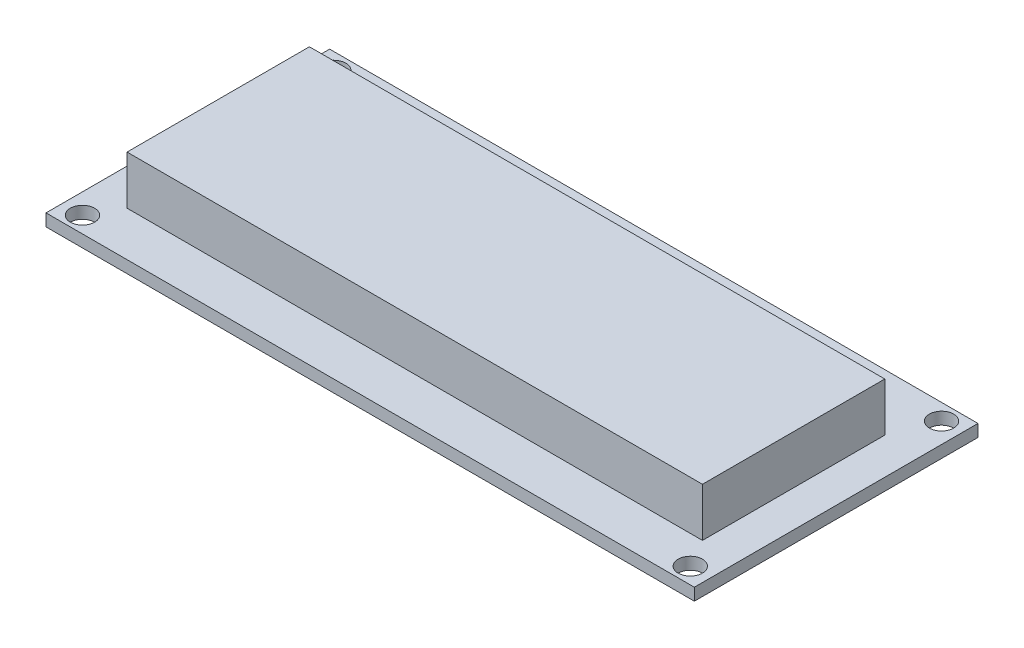
ISO-10303-21;
HEADER;
FILE_DESCRIPTION(('STEP AP214'),'2;1');
FILE_NAME('part.step','',(''),(''),'','','');
FILE_SCHEMA(('AUTOMOTIVE_DESIGN { 1 0 10303 214 1 1 1 1 }'));
ENDSEC;
DATA;
#1=APPLICATION_CONTEXT('core data for automotive mechanical design processes');
#2=APPLICATION_PROTOCOL_DEFINITION('international standard','automotive_design',2000,#1);
#3=PRODUCT_CONTEXT('',#1,'mechanical');
#4=PRODUCT('Part','Part','',(#3));
#5=PRODUCT_RELATED_PRODUCT_CATEGORY('part','',(#4));
#6=PRODUCT_DEFINITION_FORMATION('','',#4);
#7=PRODUCT_DEFINITION_CONTEXT('part definition',#1,'design');
#8=PRODUCT_DEFINITION('design','',#6,#7);
#9=PRODUCT_DEFINITION_SHAPE('','',#8);
#10=(LENGTH_UNIT() NAMED_UNIT(*) SI_UNIT(.MILLI.,.METRE.));
#11=(NAMED_UNIT(*) PLANE_ANGLE_UNIT() SI_UNIT($,.RADIAN.));
#12=(NAMED_UNIT(*) SI_UNIT($,.STERADIAN.) SOLID_ANGLE_UNIT());
#13=UNCERTAINTY_MEASURE_WITH_UNIT(LENGTH_MEASURE(1.E-05),#10,'distance_accuracy_value','');
#14=(GEOMETRIC_REPRESENTATION_CONTEXT(3) GLOBAL_UNCERTAINTY_ASSIGNED_CONTEXT((#13)) GLOBAL_UNIT_ASSIGNED_CONTEXT((#10,
#11,#12)) REPRESENTATION_CONTEXT('',''));
#15=CARTESIAN_POINT('',(0.,0.,0.));
#16=DIRECTION('',(0.,0.,1.));
#17=DIRECTION('',(1.,0.,0.));
#18=AXIS2_PLACEMENT_3D('',#15,#16,#17);
#19=CARTESIAN_POINT('',(0.,0.,0.));
#20=DIRECTION('',(0.,1.,0.));
#21=DIRECTION('',(0.,0.,1.));
#22=AXIS2_PLACEMENT_3D('',#19,#20,#21);
#23=PLANE('',#22);
#24=CARTESIAN_POINT('',(2.5,0.,33.));
#25=DIRECTION('',(0.,1.,0.));
#26=DIRECTION('',(0.,0.,-1.));
#27=AXIS2_PLACEMENT_3D('',#24,#25,#26);
#28=CIRCLE('',#27,1.5);
#29=CARTESIAN_POINT('',(2.5,0.,31.5));
#30=VERTEX_POINT('',#29);
#31=EDGE_CURVE('E242',#30,#30,#28,.T.);
#32=ORIENTED_EDGE('',*,*,#31,.T.);
#33=EDGE_LOOP('',(#32));
#34=FACE_BOUND('',#33,.T.);
#35=CARTESIAN_POINT('',(77.5,0.,33.));
#36=DIRECTION('',(0.,1.,0.));
#37=DIRECTION('',(0.,0.,1.));
#38=AXIS2_PLACEMENT_3D('',#35,#36,#37);
#39=CIRCLE('',#38,1.5);
#40=CARTESIAN_POINT('',(77.5,0.,34.5));
#41=VERTEX_POINT('',#40);
#42=EDGE_CURVE('E246',#41,#41,#39,.T.);
#43=ORIENTED_EDGE('',*,*,#42,.T.);
#44=EDGE_LOOP('',(#43));
#45=FACE_BOUND('',#44,.T.);
#46=CARTESIAN_POINT('',(77.5,0.,2.));
#47=DIRECTION('',(0.,1.,0.));
#48=DIRECTION('',(0.,0.,-1.));
#49=AXIS2_PLACEMENT_3D('',#46,#47,#48);
#50=CIRCLE('',#49,1.5);
#51=CARTESIAN_POINT('',(77.5,0.,0.500000000000002));
#52=VERTEX_POINT('',#51);
#53=EDGE_CURVE('E252',#52,#52,#50,.T.);
#54=ORIENTED_EDGE('',*,*,#53,.T.);
#55=EDGE_LOOP('',(#54));
#56=FACE_BOUND('',#55,.T.);
#57=CARTESIAN_POINT('',(2.5,0.,2.));
#58=DIRECTION('',(0.,1.,0.));
#59=DIRECTION('',(0.,0.,1.));
#60=AXIS2_PLACEMENT_3D('',#57,#58,#59);
#61=CIRCLE('',#60,1.5);
#62=CARTESIAN_POINT('',(2.5,0.,3.5));
#63=VERTEX_POINT('',#62);
#64=EDGE_CURVE('E258',#63,#63,#61,.T.);
#65=ORIENTED_EDGE('',*,*,#64,.T.);
#66=EDGE_LOOP('',(#65));
#67=FACE_BOUND('',#66,.T.);
#68=DIRECTION('',(-1.,0.,0.));
#69=VECTOR('',#68,1.);
#70=CARTESIAN_POINT('',(0.,0.,0.));
#71=LINE('',#70,#69);
#72=CARTESIAN_POINT('',(5.5,0.,0.));
#73=VERTEX_POINT('',#72);
#74=CARTESIAN_POINT('',(0.,0.,0.));
#75=VERTEX_POINT('',#74);
#76=EDGE_CURVE('E284',#73,#75,#71,.T.);
#77=ORIENTED_EDGE('',*,*,#76,.F.);
#78=DIRECTION('',(0.,0.,1.));
#79=VECTOR('',#78,1.);
#80=CARTESIAN_POINT('',(5.5,0.,0.));
#81=LINE('',#80,#79);
#82=CARTESIAN_POINT('',(5.5,0.,3.5));
#83=VERTEX_POINT('',#82);
#84=EDGE_CURVE('E64',#73,#83,#81,.T.);
#85=ORIENTED_EDGE('',*,*,#84,.T.);
#86=DIRECTION('',(1.,0.,0.));
#87=VECTOR('',#86,1.);
#88=CARTESIAN_POINT('',(0.,0.,3.5));
#89=LINE('',#88,#87);
#90=CARTESIAN_POINT('',(50.,0.,3.5));
#91=VERTEX_POINT('',#90);
#92=EDGE_CURVE('E298',#83,#91,#89,.T.);
#93=ORIENTED_EDGE('',*,*,#92,.T.);
#94=DIRECTION('',(0.,0.,1.));
#95=VECTOR('',#94,1.);
#96=CARTESIAN_POINT('',(50.,0.,0.));
#97=LINE('',#96,#95);
#98=CARTESIAN_POINT('',(50.,0.,0.));
#99=VERTEX_POINT('',#98);
#100=EDGE_CURVE('E199',#99,#91,#97,.T.);
#101=ORIENTED_EDGE('',*,*,#100,.F.);
#102=CARTESIAN_POINT('',(80.,0.,0.));
#103=VERTEX_POINT('',#102);
#104=EDGE_CURVE('E271',#103,#99,#71,.T.);
#105=ORIENTED_EDGE('',*,*,#104,.F.);
#106=DIRECTION('',(0.,0.,-1.));
#107=VECTOR('',#106,1.);
#108=CARTESIAN_POINT('',(80.,0.,0.));
#109=LINE('',#108,#107);
#110=CARTESIAN_POINT('',(80.,0.,35.));
#111=VERTEX_POINT('',#110);
#112=EDGE_CURVE('E282',#111,#103,#109,.T.);
#113=ORIENTED_EDGE('',*,*,#112,.F.);
#114=DIRECTION('',(1.,0.,0.));
#115=VECTOR('',#114,1.);
#116=CARTESIAN_POINT('',(0.,0.,35.));
#117=LINE('',#116,#115);
#118=CARTESIAN_POINT('',(0.,0.,35.));
#119=VERTEX_POINT('',#118);
#120=EDGE_CURVE('E280',#119,#111,#117,.T.);
#121=ORIENTED_EDGE('',*,*,#120,.F.);
#122=DIRECTION('',(0.,0.,1.));
#123=VECTOR('',#122,1.);
#124=CARTESIAN_POINT('',(0.,0.,0.));
#125=LINE('',#124,#123);
#126=EDGE_CURVE('E264',#75,#119,#125,.T.);
#127=ORIENTED_EDGE('',*,*,#126,.F.);
#128=EDGE_LOOP('',(#77,#85,#93,#101,#105,#113,#121,#127));
#129=FACE_BOUND('',#128,.T.);
#130=DIRECTION('',(0.,0.,1.));
#131=VECTOR('',#130,1.);
#132=CARTESIAN_POINT('',(4.5,0.,0.));
#133=LINE('',#132,#131);
#134=CARTESIAN_POINT('',(4.5,0.,7.));
#135=VERTEX_POINT('',#134);
#136=CARTESIAN_POINT('',(4.5,0.,29.5));
#137=VERTEX_POINT('',#136);
#138=EDGE_CURVE('E49',#135,#137,#133,.T.);
#139=ORIENTED_EDGE('',*,*,#138,.T.);
#140=DIRECTION('',(1.,0.,0.));
#141=VECTOR('',#140,1.);
#142=CARTESIAN_POINT('',(0.,0.,29.5));
#143=LINE('',#142,#141);
#144=CARTESIAN_POINT('',(75.5,0.,29.5));
#145=VERTEX_POINT('',#144);
#146=EDGE_CURVE('E11',#137,#145,#143,.T.);
#147=ORIENTED_EDGE('',*,*,#146,.T.);
#148=DIRECTION('',(0.,0.,-1.));
#149=VECTOR('',#148,1.);
#150=CARTESIAN_POINT('',(75.5,0.,0.));
#151=LINE('',#150,#149);
#152=CARTESIAN_POINT('',(75.5,0.,7.));
#153=VERTEX_POINT('',#152);
#154=EDGE_CURVE('E56',#145,#153,#151,.T.);
#155=ORIENTED_EDGE('',*,*,#154,.T.);
#156=DIRECTION('',(-1.,0.,0.));
#157=VECTOR('',#156,1.);
#158=CARTESIAN_POINT('',(0.,0.,7.));
#159=LINE('',#158,#157);
#160=EDGE_CURVE('E301',#153,#135,#159,.T.);
#161=ORIENTED_EDGE('',*,*,#160,.T.);
#162=EDGE_LOOP('',(#139,#147,#155,#161));
#163=FACE_BOUND('',#162,.T.);
#164=ADVANCED_FACE('F41',(#34,#45,#56,#67,#129,#163),#23,.F.);
#165=CARTESIAN_POINT('',(0.,1.5,0.));
#166=DIRECTION('',(0.,1.,0.));
#167=DIRECTION('',(0.,0.,1.));
#168=AXIS2_PLACEMENT_3D('',#165,#166,#167);
#169=PLANE('',#168);
#170=DIRECTION('',(-1.,0.,0.));
#171=VECTOR('',#170,1.);
#172=CARTESIAN_POINT('',(0.,1.5,0.));
#173=LINE('',#172,#171);
#174=CARTESIAN_POINT('',(80.,1.5,0.));
#175=VERTEX_POINT('',#174);
#176=CARTESIAN_POINT('',(0.,1.5,0.));
#177=VERTEX_POINT('',#176);
#178=EDGE_CURVE('E275',#175,#177,#173,.T.);
#179=ORIENTED_EDGE('',*,*,#178,.T.);
#180=DIRECTION('',(0.,0.,1.));
#181=VECTOR('',#180,1.);
#182=CARTESIAN_POINT('',(0.,1.5,0.));
#183=LINE('',#182,#181);
#184=CARTESIAN_POINT('',(0.,1.5,35.));
#185=VERTEX_POINT('',#184);
#186=EDGE_CURVE('E267',#177,#185,#183,.T.);
#187=ORIENTED_EDGE('',*,*,#186,.T.);
#188=DIRECTION('',(1.,0.,0.));
#189=VECTOR('',#188,1.);
#190=CARTESIAN_POINT('',(0.,1.5,35.));
#191=LINE('',#190,#189);
#192=CARTESIAN_POINT('',(80.,1.5,35.));
#193=VERTEX_POINT('',#192);
#194=EDGE_CURVE('E270',#185,#193,#191,.T.);
#195=ORIENTED_EDGE('',*,*,#194,.T.);
#196=DIRECTION('',(0.,0.,-1.));
#197=VECTOR('',#196,1.);
#198=CARTESIAN_POINT('',(80.,1.5,0.));
#199=LINE('',#198,#197);
#200=EDGE_CURVE('E273',#193,#175,#199,.T.);
#201=ORIENTED_EDGE('',*,*,#200,.T.);
#202=EDGE_LOOP('',(#179,#187,#195,#201));
#203=FACE_BOUND('',#202,.T.);
#204=DIRECTION('',(0.,0.,1.));
#205=VECTOR('',#204,1.);
#206=CARTESIAN_POINT('',(4.5,1.5,7.));
#207=LINE('',#206,#205);
#208=CARTESIAN_POINT('',(4.5,1.5,7.));
#209=VERTEX_POINT('',#208);
#210=CARTESIAN_POINT('',(4.5,1.5,29.5));
#211=VERTEX_POINT('',#210);
#212=EDGE_CURVE('E211',#209,#211,#207,.T.);
#213=ORIENTED_EDGE('',*,*,#212,.F.);
#214=DIRECTION('',(-1.,0.,0.));
#215=VECTOR('',#214,1.);
#216=CARTESIAN_POINT('',(4.5,1.5,7.));
#217=LINE('',#216,#215);
#218=CARTESIAN_POINT('',(75.5,1.5,7.));
#219=VERTEX_POINT('',#218);
#220=EDGE_CURVE('E216',#219,#209,#217,.T.);
#221=ORIENTED_EDGE('',*,*,#220,.F.);
#222=DIRECTION('',(0.,0.,-1.));
#223=VECTOR('',#222,1.);
#224=CARTESIAN_POINT('',(75.5,1.5,7.));
#225=LINE('',#224,#223);
#226=CARTESIAN_POINT('',(75.5,1.5,29.5));
#227=VERTEX_POINT('',#226);
#228=EDGE_CURVE('E227',#227,#219,#225,.T.);
#229=ORIENTED_EDGE('',*,*,#228,.F.);
#230=DIRECTION('',(1.,0.,0.));
#231=VECTOR('',#230,1.);
#232=CARTESIAN_POINT('',(4.5,1.5,29.5));
#233=LINE('',#232,#231);
#234=EDGE_CURVE('E224',#211,#227,#233,.T.);
#235=ORIENTED_EDGE('',*,*,#234,.F.);
#236=EDGE_LOOP('',(#213,#221,#229,#235));
#237=FACE_BOUND('',#236,.T.);
#238=CARTESIAN_POINT('',(77.5,1.5,33.));
#239=DIRECTION('',(0.,1.,0.));
#240=DIRECTION('',(0.,0.,1.));
#241=AXIS2_PLACEMENT_3D('',#238,#239,#240);
#242=CIRCLE('',#241,1.5);
#243=CARTESIAN_POINT('',(77.5,1.5,34.5));
#244=VERTEX_POINT('',#243);
#245=EDGE_CURVE('E249',#244,#244,#242,.T.);
#246=ORIENTED_EDGE('',*,*,#245,.F.);
#247=EDGE_LOOP('',(#246));
#248=FACE_BOUND('',#247,.T.);
#249=CARTESIAN_POINT('',(2.5,1.5,2.));
#250=DIRECTION('',(0.,1.,0.));
#251=DIRECTION('',(0.,0.,1.));
#252=AXIS2_PLACEMENT_3D('',#249,#250,#251);
#253=CIRCLE('',#252,1.5);
#254=CARTESIAN_POINT('',(2.5,1.5,3.5));
#255=VERTEX_POINT('',#254);
#256=EDGE_CURVE('E261',#255,#255,#253,.T.);
#257=ORIENTED_EDGE('',*,*,#256,.F.);
#258=EDGE_LOOP('',(#257));
#259=FACE_BOUND('',#258,.T.);
#260=CARTESIAN_POINT('',(77.5,1.5,2.));
#261=DIRECTION('',(0.,1.,0.));
#262=DIRECTION('',(0.,0.,-1.));
#263=AXIS2_PLACEMENT_3D('',#260,#261,#262);
#264=CIRCLE('',#263,1.5);
#265=CARTESIAN_POINT('',(77.5,1.5,0.500000000000002));
#266=VERTEX_POINT('',#265);
#267=EDGE_CURVE('E255',#266,#266,#264,.T.);
#268=ORIENTED_EDGE('',*,*,#267,.F.);
#269=EDGE_LOOP('',(#268));
#270=FACE_BOUND('',#269,.T.);
#271=CARTESIAN_POINT('',(2.5,1.5,33.));
#272=DIRECTION('',(0.,1.,0.));
#273=DIRECTION('',(0.,0.,-1.));
#274=AXIS2_PLACEMENT_3D('',#271,#272,#273);
#275=CIRCLE('',#274,1.5);
#276=CARTESIAN_POINT('',(2.5,1.5,31.5));
#277=VERTEX_POINT('',#276);
#278=EDGE_CURVE('E243',#277,#277,#275,.T.);
#279=ORIENTED_EDGE('',*,*,#278,.F.);
#280=EDGE_LOOP('',(#279));
#281=FACE_BOUND('',#280,.T.);
#282=ADVANCED_FACE('F321',(#203,#237,#248,#259,#270,#281),#169,.T.);
#283=CARTESIAN_POINT('',(0.,1.5,0.));
#284=DIRECTION('',(1.,0.,0.));
#285=DIRECTION('',(0.,0.,-1.));
#286=AXIS2_PLACEMENT_3D('',#283,#284,#285);
#287=PLANE('',#286);
#288=ORIENTED_EDGE('',*,*,#126,.T.);
#289=DIRECTION('',(0.,-1.,0.));
#290=VECTOR('',#289,1.);
#291=CARTESIAN_POINT('',(0.,1.5,35.));
#292=LINE('',#291,#290);
#293=EDGE_CURVE('E295',#185,#119,#292,.T.);
#294=ORIENTED_EDGE('',*,*,#293,.F.);
#295=ORIENTED_EDGE('',*,*,#186,.F.);
#296=DIRECTION('',(0.,-1.,0.));
#297=VECTOR('',#296,1.);
#298=CARTESIAN_POINT('',(0.,1.5,0.));
#299=LINE('',#298,#297);
#300=EDGE_CURVE('E277',#177,#75,#299,.T.);
#301=ORIENTED_EDGE('',*,*,#300,.T.);
#302=EDGE_LOOP('',(#288,#294,#295,#301));
#303=FACE_BOUND('',#302,.T.);
#304=ADVANCED_FACE('F43',(#303),#287,.F.);
#305=CARTESIAN_POINT('',(0.,1.5,35.));
#306=DIRECTION('',(0.,0.,-1.));
#307=DIRECTION('',(-1.,0.,0.));
#308=AXIS2_PLACEMENT_3D('',#305,#306,#307);
#309=PLANE('',#308);
#310=ORIENTED_EDGE('',*,*,#120,.T.);
#311=DIRECTION('',(0.,-1.,0.));
#312=VECTOR('',#311,1.);
#313=CARTESIAN_POINT('',(80.,1.5,35.));
#314=LINE('',#313,#312);
#315=EDGE_CURVE('E292',#193,#111,#314,.T.);
#316=ORIENTED_EDGE('',*,*,#315,.F.);
#317=ORIENTED_EDGE('',*,*,#194,.F.);
#318=ORIENTED_EDGE('',*,*,#293,.T.);
#319=EDGE_LOOP('',(#310,#316,#317,#318));
#320=FACE_BOUND('',#319,.T.);
#321=ADVANCED_FACE('F339',(#320),#309,.F.);
#322=CARTESIAN_POINT('',(80.,1.5,0.));
#323=DIRECTION('',(-1.,0.,0.));
#324=DIRECTION('',(0.,0.,1.));
#325=AXIS2_PLACEMENT_3D('',#322,#323,#324);
#326=PLANE('',#325);
#327=ORIENTED_EDGE('',*,*,#112,.T.);
#328=DIRECTION('',(0.,-1.,0.));
#329=VECTOR('',#328,1.);
#330=CARTESIAN_POINT('',(80.,1.5,0.));
#331=LINE('',#330,#329);
#332=EDGE_CURVE('E289',#175,#103,#331,.T.);
#333=ORIENTED_EDGE('',*,*,#332,.F.);
#334=ORIENTED_EDGE('',*,*,#200,.F.);
#335=ORIENTED_EDGE('',*,*,#315,.T.);
#336=EDGE_LOOP('',(#327,#333,#334,#335));
#337=FACE_BOUND('',#336,.T.);
#338=ADVANCED_FACE('F336',(#337),#326,.F.);
#339=CARTESIAN_POINT('',(0.,1.5,0.));
#340=DIRECTION('',(0.,0.,1.));
#341=DIRECTION('',(1.,0.,0.));
#342=AXIS2_PLACEMENT_3D('',#339,#340,#341);
#343=PLANE('',#342);
#344=ORIENTED_EDGE('',*,*,#300,.F.);
#345=ORIENTED_EDGE('',*,*,#178,.F.);
#346=ORIENTED_EDGE('',*,*,#332,.T.);
#347=ORIENTED_EDGE('',*,*,#104,.T.);
#348=DIRECTION('',(0.,1.,0.));
#349=VECTOR('',#348,1.);
#350=CARTESIAN_POINT('',(50.,-10.,0.));
#351=LINE('',#350,#349);
#352=CARTESIAN_POINT('',(50.,-10.,0.));
#353=VERTEX_POINT('',#352);
#354=EDGE_CURVE('E203',#353,#99,#351,.T.);
#355=ORIENTED_EDGE('',*,*,#354,.F.);
#356=DIRECTION('',(1.,0.,0.));
#357=VECTOR('',#356,1.);
#358=CARTESIAN_POINT('',(5.5,-10.,0.));
#359=LINE('',#358,#357);
#360=CARTESIAN_POINT('',(5.5,-10.,0.));
#361=VERTEX_POINT('',#360);
#362=EDGE_CURVE('E190',#361,#353,#359,.T.);
#363=ORIENTED_EDGE('',*,*,#362,.F.);
#364=DIRECTION('',(0.,1.,0.));
#365=VECTOR('',#364,1.);
#366=CARTESIAN_POINT('',(5.5,-10.,0.));
#367=LINE('',#366,#365);
#368=EDGE_CURVE('E200',#361,#73,#367,.T.);
#369=ORIENTED_EDGE('',*,*,#368,.T.);
#370=ORIENTED_EDGE('',*,*,#76,.T.);
#371=EDGE_LOOP('',(#344,#345,#346,#347,#355,#363,#369,#370));
#372=FACE_BOUND('',#371,.T.);
#373=ADVANCED_FACE('F332',(#372),#343,.F.);
#374=CARTESIAN_POINT('',(2.5,1.5,2.));
#375=DIRECTION('',(0.,-1.,0.));
#376=DIRECTION('',(0.,0.,-1.));
#377=AXIS2_PLACEMENT_3D('',#374,#375,#376);
#378=CYLINDRICAL_SURFACE('',#377,1.5);
#379=ORIENTED_EDGE('',*,*,#256,.T.);
#380=EDGE_LOOP('',(#379));
#381=FACE_BOUND('',#380,.T.);
#382=ORIENTED_EDGE('',*,*,#64,.F.);
#383=EDGE_LOOP('',(#382));
#384=FACE_BOUND('',#383,.T.);
#385=ADVANCED_FACE('F335',(#381,#384),#378,.F.);
#386=CARTESIAN_POINT('',(77.5,1.5,2.));
#387=DIRECTION('',(0.,-1.,0.));
#388=DIRECTION('',(0.,0.,-1.));
#389=AXIS2_PLACEMENT_3D('',#386,#387,#388);
#390=CYLINDRICAL_SURFACE('',#389,1.5);
#391=ORIENTED_EDGE('',*,*,#267,.T.);
#392=EDGE_LOOP('',(#391));
#393=FACE_BOUND('',#392,.T.);
#394=ORIENTED_EDGE('',*,*,#53,.F.);
#395=EDGE_LOOP('',(#394));
#396=FACE_BOUND('',#395,.T.);
#397=ADVANCED_FACE('F403',(#393,#396),#390,.F.);
#398=CARTESIAN_POINT('',(77.5,1.5,33.));
#399=DIRECTION('',(0.,-1.,0.));
#400=DIRECTION('',(0.,0.,-1.));
#401=AXIS2_PLACEMENT_3D('',#398,#399,#400);
#402=CYLINDRICAL_SURFACE('',#401,1.5);
#403=ORIENTED_EDGE('',*,*,#245,.T.);
#404=EDGE_LOOP('',(#403));
#405=FACE_BOUND('',#404,.T.);
#406=ORIENTED_EDGE('',*,*,#42,.F.);
#407=EDGE_LOOP('',(#406));
#408=FACE_BOUND('',#407,.T.);
#409=ADVANCED_FACE('F399',(#405,#408),#402,.F.);
#410=CARTESIAN_POINT('',(2.5,1.5,33.));
#411=DIRECTION('',(0.,-1.,0.));
#412=DIRECTION('',(0.,0.,-1.));
#413=AXIS2_PLACEMENT_3D('',#410,#411,#412);
#414=CYLINDRICAL_SURFACE('',#413,1.5);
#415=ORIENTED_EDGE('',*,*,#278,.T.);
#416=EDGE_LOOP('',(#415));
#417=FACE_BOUND('',#416,.T.);
#418=ORIENTED_EDGE('',*,*,#31,.F.);
#419=EDGE_LOOP('',(#418));
#420=FACE_BOUND('',#419,.T.);
#421=ADVANCED_FACE('F395',(#417,#420),#414,.F.);
#422=CARTESIAN_POINT('',(4.5,7.5,7.));
#423=DIRECTION('',(1.,0.,0.));
#424=DIRECTION('',(0.,0.,-1.));
#425=AXIS2_PLACEMENT_3D('',#422,#423,#424);
#426=PLANE('',#425);
#427=ORIENTED_EDGE('',*,*,#212,.T.);
#428=DIRECTION('',(0.,-1.,0.));
#429=VECTOR('',#428,1.);
#430=CARTESIAN_POINT('',(4.5,7.5,29.5));
#431=LINE('',#430,#429);
#432=CARTESIAN_POINT('',(4.5,7.5,29.5));
#433=VERTEX_POINT('',#432);
#434=EDGE_CURVE('E239',#433,#211,#431,.T.);
#435=ORIENTED_EDGE('',*,*,#434,.F.);
#436=DIRECTION('',(0.,0.,1.));
#437=VECTOR('',#436,1.);
#438=CARTESIAN_POINT('',(4.5,7.5,7.));
#439=LINE('',#438,#437);
#440=CARTESIAN_POINT('',(4.5,7.5,7.));
#441=VERTEX_POINT('',#440);
#442=EDGE_CURVE('E212',#441,#433,#439,.T.);
#443=ORIENTED_EDGE('',*,*,#442,.F.);
#444=DIRECTION('',(0.,-1.,0.));
#445=VECTOR('',#444,1.);
#446=CARTESIAN_POINT('',(4.5,7.5,7.));
#447=LINE('',#446,#445);
#448=EDGE_CURVE('E222',#441,#209,#447,.T.);
#449=ORIENTED_EDGE('',*,*,#448,.T.);
#450=EDGE_LOOP('',(#427,#435,#443,#449));
#451=FACE_BOUND('',#450,.T.);
#452=ADVANCED_FACE('F391',(#451),#426,.F.);
#453=CARTESIAN_POINT('',(4.5,7.5,29.5));
#454=DIRECTION('',(0.,0.,-1.));
#455=DIRECTION('',(-1.,0.,0.));
#456=AXIS2_PLACEMENT_3D('',#453,#454,#455);
#457=PLANE('',#456);
#458=ORIENTED_EDGE('',*,*,#234,.T.);
#459=DIRECTION('',(0.,-1.,0.));
#460=VECTOR('',#459,1.);
#461=CARTESIAN_POINT('',(75.5,7.5,29.5));
#462=LINE('',#461,#460);
#463=CARTESIAN_POINT('',(75.5,7.5,29.5));
#464=VERTEX_POINT('',#463);
#465=EDGE_CURVE('E236',#464,#227,#462,.T.);
#466=ORIENTED_EDGE('',*,*,#465,.F.);
#467=DIRECTION('',(1.,0.,0.));
#468=VECTOR('',#467,1.);
#469=CARTESIAN_POINT('',(4.5,7.5,29.5));
#470=LINE('',#469,#468);
#471=EDGE_CURVE('E215',#433,#464,#470,.T.);
#472=ORIENTED_EDGE('',*,*,#471,.F.);
#473=ORIENTED_EDGE('',*,*,#434,.T.);
#474=EDGE_LOOP('',(#458,#466,#472,#473));
#475=FACE_BOUND('',#474,.T.);
#476=ADVANCED_FACE('F387',(#475),#457,.F.);
#477=CARTESIAN_POINT('',(75.5,7.5,7.));
#478=DIRECTION('',(-1.,0.,0.));
#479=DIRECTION('',(0.,0.,1.));
#480=AXIS2_PLACEMENT_3D('',#477,#478,#479);
#481=PLANE('',#480);
#482=ORIENTED_EDGE('',*,*,#228,.T.);
#483=DIRECTION('',(0.,-1.,0.));
#484=VECTOR('',#483,1.);
#485=CARTESIAN_POINT('',(75.5,7.5,7.));
#486=LINE('',#485,#484);
#487=CARTESIAN_POINT('',(75.5,7.5,7.));
#488=VERTEX_POINT('',#487);
#489=EDGE_CURVE('E233',#488,#219,#486,.T.);
#490=ORIENTED_EDGE('',*,*,#489,.F.);
#491=DIRECTION('',(0.,0.,-1.));
#492=VECTOR('',#491,1.);
#493=CARTESIAN_POINT('',(75.5,7.5,7.));
#494=LINE('',#493,#492);
#495=EDGE_CURVE('E218',#464,#488,#494,.T.);
#496=ORIENTED_EDGE('',*,*,#495,.F.);
#497=ORIENTED_EDGE('',*,*,#465,.T.);
#498=EDGE_LOOP('',(#482,#490,#496,#497));
#499=FACE_BOUND('',#498,.T.);
#500=ADVANCED_FACE('F384',(#499),#481,.F.);
#501=CARTESIAN_POINT('',(4.5,7.5,7.));
#502=DIRECTION('',(0.,0.,1.));
#503=DIRECTION('',(1.,0.,0.));
#504=AXIS2_PLACEMENT_3D('',#501,#502,#503);
#505=PLANE('',#504);
#506=ORIENTED_EDGE('',*,*,#220,.T.);
#507=ORIENTED_EDGE('',*,*,#448,.F.);
#508=DIRECTION('',(-1.,0.,0.));
#509=VECTOR('',#508,1.);
#510=CARTESIAN_POINT('',(4.5,7.5,7.));
#511=LINE('',#510,#509);
#512=EDGE_CURVE('E220',#488,#441,#511,.T.);
#513=ORIENTED_EDGE('',*,*,#512,.F.);
#514=ORIENTED_EDGE('',*,*,#489,.T.);
#515=EDGE_LOOP('',(#506,#507,#513,#514));
#516=FACE_BOUND('',#515,.T.);
#517=ADVANCED_FACE('F377',(#516),#505,.F.);
#518=CARTESIAN_POINT('',(0.,7.5,0.));
#519=DIRECTION('',(0.,1.,0.));
#520=DIRECTION('',(0.,0.,1.));
#521=AXIS2_PLACEMENT_3D('',#518,#519,#520);
#522=PLANE('',#521);
#523=ORIENTED_EDGE('',*,*,#442,.T.);
#524=ORIENTED_EDGE('',*,*,#471,.T.);
#525=ORIENTED_EDGE('',*,*,#495,.T.);
#526=ORIENTED_EDGE('',*,*,#512,.T.);
#527=EDGE_LOOP('',(#523,#524,#525,#526));
#528=FACE_BOUND('',#527,.T.);
#529=ADVANCED_FACE('F370',(#528),#522,.T.);
#530=CARTESIAN_POINT('',(5.5,-10.,3.5));
#531=DIRECTION('',(0.,0.,1.));
#532=DIRECTION('',(1.,0.,0.));
#533=AXIS2_PLACEMENT_3D('',#530,#531,#532);
#534=PLANE('',#533);
#535=ORIENTED_EDGE('',*,*,#92,.F.);
#536=DIRECTION('',(0.,1.,0.));
#537=VECTOR('',#536,1.);
#538=CARTESIAN_POINT('',(5.5,-10.,3.5));
#539=LINE('',#538,#537);
#540=CARTESIAN_POINT('',(5.5,-10.,3.5));
#541=VERTEX_POINT('',#540);
#542=EDGE_CURVE('E196',#541,#83,#539,.T.);
#543=ORIENTED_EDGE('',*,*,#542,.F.);
#544=DIRECTION('',(1.,0.,0.));
#545=VECTOR('',#544,1.);
#546=CARTESIAN_POINT('',(5.5,-10.,3.5));
#547=LINE('',#546,#545);
#548=CARTESIAN_POINT('',(50.,-10.,3.5));
#549=VERTEX_POINT('',#548);
#550=EDGE_CURVE('E184',#541,#549,#547,.T.);
#551=ORIENTED_EDGE('',*,*,#550,.T.);
#552=DIRECTION('',(0.,1.,0.));
#553=VECTOR('',#552,1.);
#554=CARTESIAN_POINT('',(50.,-10.,3.5));
#555=LINE('',#554,#553);
#556=EDGE_CURVE('E195',#549,#91,#555,.T.);
#557=ORIENTED_EDGE('',*,*,#556,.T.);
#558=EDGE_LOOP('',(#535,#543,#551,#557));
#559=FACE_BOUND('',#558,.T.);
#560=ADVANCED_FACE('F368',(#559),#534,.T.);
#561=CARTESIAN_POINT('',(5.5,-10.,0.));
#562=DIRECTION('',(-1.,0.,0.));
#563=DIRECTION('',(0.,0.,1.));
#564=AXIS2_PLACEMENT_3D('',#561,#562,#563);
#565=PLANE('',#564);
#566=ORIENTED_EDGE('',*,*,#84,.F.);
#567=ORIENTED_EDGE('',*,*,#368,.F.);
#568=DIRECTION('',(0.,0.,1.));
#569=VECTOR('',#568,1.);
#570=CARTESIAN_POINT('',(5.5,-10.,0.));
#571=LINE('',#570,#569);
#572=EDGE_CURVE('E192',#361,#541,#571,.T.);
#573=ORIENTED_EDGE('',*,*,#572,.T.);
#574=ORIENTED_EDGE('',*,*,#542,.T.);
#575=EDGE_LOOP('',(#566,#567,#573,#574));
#576=FACE_BOUND('',#575,.T.);
#577=ADVANCED_FACE('F366',(#576),#565,.T.);
#578=CARTESIAN_POINT('',(50.,-10.,0.));
#579=DIRECTION('',(-1.,0.,0.));
#580=DIRECTION('',(0.,0.,1.));
#581=AXIS2_PLACEMENT_3D('',#578,#579,#580);
#582=PLANE('',#581);
#583=ORIENTED_EDGE('',*,*,#354,.T.);
#584=ORIENTED_EDGE('',*,*,#100,.T.);
#585=ORIENTED_EDGE('',*,*,#556,.F.);
#586=DIRECTION('',(0.,0.,1.));
#587=VECTOR('',#586,1.);
#588=CARTESIAN_POINT('',(50.,-10.,0.));
#589=LINE('',#588,#587);
#590=EDGE_CURVE('E188',#353,#549,#589,.T.);
#591=ORIENTED_EDGE('',*,*,#590,.F.);
#592=EDGE_LOOP('',(#583,#584,#585,#591));
#593=FACE_BOUND('',#592,.T.);
#594=ADVANCED_FACE('F360',(#593),#582,.F.);
#595=CARTESIAN_POINT('',(0.,-10.,0.));
#596=DIRECTION('',(0.,-1.,0.));
#597=DIRECTION('',(0.,0.,-1.));
#598=AXIS2_PLACEMENT_3D('',#595,#596,#597);
#599=PLANE('',#598);
#600=ORIENTED_EDGE('',*,*,#550,.F.);
#601=ORIENTED_EDGE('',*,*,#572,.F.);
#602=ORIENTED_EDGE('',*,*,#362,.T.);
#603=ORIENTED_EDGE('',*,*,#590,.T.);
#604=EDGE_LOOP('',(#600,#601,#602,#603));
#605=FACE_BOUND('',#604,.T.);
#606=ADVANCED_FACE('F317',(#605),#599,.T.);
#607=CARTESIAN_POINT('',(4.5,-2.,7.));
#608=DIRECTION('',(-1.,0.,0.));
#609=DIRECTION('',(0.,0.,1.));
#610=AXIS2_PLACEMENT_3D('',#607,#608,#609);
#611=PLANE('',#610);
#612=ORIENTED_EDGE('',*,*,#138,.F.);
#613=DIRECTION('',(0.,1.,0.));
#614=VECTOR('',#613,1.);
#615=CARTESIAN_POINT('',(4.5,-2.,7.));
#616=LINE('',#615,#614);
#617=CARTESIAN_POINT('',(4.5,-2.,7.));
#618=VERTEX_POINT('',#617);
#619=EDGE_CURVE('E181',#618,#135,#616,.T.);
#620=ORIENTED_EDGE('',*,*,#619,.F.);
#621=DIRECTION('',(0.,0.,1.));
#622=VECTOR('',#621,1.);
#623=CARTESIAN_POINT('',(4.5,-2.,7.));
#624=LINE('',#623,#622);
#625=CARTESIAN_POINT('',(4.5,-2.,29.5));
#626=VERTEX_POINT('',#625);
#627=EDGE_CURVE('E164',#618,#626,#624,.T.);
#628=ORIENTED_EDGE('',*,*,#627,.T.);
#629=DIRECTION('',(0.,1.,0.));
#630=VECTOR('',#629,1.);
#631=CARTESIAN_POINT('',(4.5,-2.,29.5));
#632=LINE('',#631,#630);
#633=EDGE_CURVE('E170',#626,#137,#632,.T.);
#634=ORIENTED_EDGE('',*,*,#633,.T.);
#635=EDGE_LOOP('',(#612,#620,#628,#634));
#636=FACE_BOUND('',#635,.T.);
#637=ADVANCED_FACE('F305',(#636),#611,.T.);
#638=CARTESIAN_POINT('',(4.5,-2.,7.));
#639=DIRECTION('',(0.,0.,-1.));
#640=DIRECTION('',(-1.,0.,0.));
#641=AXIS2_PLACEMENT_3D('',#638,#639,#640);
#642=PLANE('',#641);
#643=ORIENTED_EDGE('',*,*,#160,.F.);
#644=DIRECTION('',(0.,1.,0.));
#645=VECTOR('',#644,1.);
#646=CARTESIAN_POINT('',(75.5,-2.,7.));
#647=LINE('',#646,#645);
#648=CARTESIAN_POINT('',(75.5,-2.,7.));
#649=VERTEX_POINT('',#648);
#650=EDGE_CURVE('E180',#649,#153,#647,.T.);
#651=ORIENTED_EDGE('',*,*,#650,.F.);
#652=DIRECTION('',(-1.,0.,0.));
#653=VECTOR('',#652,1.);
#654=CARTESIAN_POINT('',(4.5,-2.,7.));
#655=LINE('',#654,#653);
#656=EDGE_CURVE('E163',#649,#618,#655,.T.);
#657=ORIENTED_EDGE('',*,*,#656,.T.);
#658=ORIENTED_EDGE('',*,*,#619,.T.);
#659=EDGE_LOOP('',(#643,#651,#657,#658));
#660=FACE_BOUND('',#659,.T.);
#661=ADVANCED_FACE('F307',(#660),#642,.T.);
#662=CARTESIAN_POINT('',(75.5,-2.,7.));
#663=DIRECTION('',(1.,0.,0.));
#664=DIRECTION('',(0.,0.,-1.));
#665=AXIS2_PLACEMENT_3D('',#662,#663,#664);
#666=PLANE('',#665);
#667=ORIENTED_EDGE('',*,*,#154,.F.);
#668=DIRECTION('',(0.,1.,0.));
#669=VECTOR('',#668,1.);
#670=CARTESIAN_POINT('',(75.5,-2.,29.5));
#671=LINE('',#670,#669);
#672=CARTESIAN_POINT('',(75.5,-2.,29.5));
#673=VERTEX_POINT('',#672);
#674=EDGE_CURVE('E166',#673,#145,#671,.T.);
#675=ORIENTED_EDGE('',*,*,#674,.F.);
#676=DIRECTION('',(0.,0.,-1.));
#677=VECTOR('',#676,1.);
#678=CARTESIAN_POINT('',(75.5,-2.,7.));
#679=LINE('',#678,#677);
#680=EDGE_CURVE('E157',#673,#649,#679,.T.);
#681=ORIENTED_EDGE('',*,*,#680,.T.);
#682=ORIENTED_EDGE('',*,*,#650,.T.);
#683=EDGE_LOOP('',(#667,#675,#681,#682));
#684=FACE_BOUND('',#683,.T.);
#685=ADVANCED_FACE('F167',(#684),#666,.T.);
#686=CARTESIAN_POINT('',(0.,-2.,0.));
#687=DIRECTION('',(0.,1.,0.));
#688=DIRECTION('',(0.,0.,1.));
#689=AXIS2_PLACEMENT_3D('',#686,#687,#688);
#690=PLANE('',#689);
#691=ORIENTED_EDGE('',*,*,#627,.F.);
#692=ORIENTED_EDGE('',*,*,#656,.F.);
#693=ORIENTED_EDGE('',*,*,#680,.F.);
#694=DIRECTION('',(1.,0.,0.));
#695=VECTOR('',#694,1.);
#696=CARTESIAN_POINT('',(4.5,-2.,29.5));
#697=LINE('',#696,#695);
#698=EDGE_CURVE('E161',#626,#673,#697,.T.);
#699=ORIENTED_EDGE('',*,*,#698,.F.);
#700=EDGE_LOOP('',(#691,#692,#693,#699));
#701=FACE_BOUND('',#700,.T.);
#702=ADVANCED_FACE('F159',(#701),#690,.F.);
#703=CARTESIAN_POINT('',(4.5,-2.,29.5));
#704=DIRECTION('',(0.,0.,1.));
#705=DIRECTION('',(1.,0.,0.));
#706=AXIS2_PLACEMENT_3D('',#703,#704,#705);
#707=PLANE('',#706);
#708=ORIENTED_EDGE('',*,*,#146,.F.);
#709=ORIENTED_EDGE('',*,*,#633,.F.);
#710=ORIENTED_EDGE('',*,*,#698,.T.);
#711=ORIENTED_EDGE('',*,*,#674,.T.);
#712=EDGE_LOOP('',(#708,#709,#710,#711));
#713=FACE_BOUND('',#712,.T.);
#714=ADVANCED_FACE('F173',(#713),#707,.T.);
#715=CLOSED_SHELL('',(#164,#282,#304,#321,#338,#373,#385,#397,#409,#421,#452,#476,#500,#517,
#529,#560,#577,#594,#606,#637,#661,#685,#702,#714));
#716=MANIFOLD_SOLID_BREP('B2',#715);
#717=ADVANCED_BREP_SHAPE_REPRESENTATION('',(#18,#716),#14);
#718=SHAPE_DEFINITION_REPRESENTATION(#9,#717);
ENDSEC;
END-ISO-10303-21;
